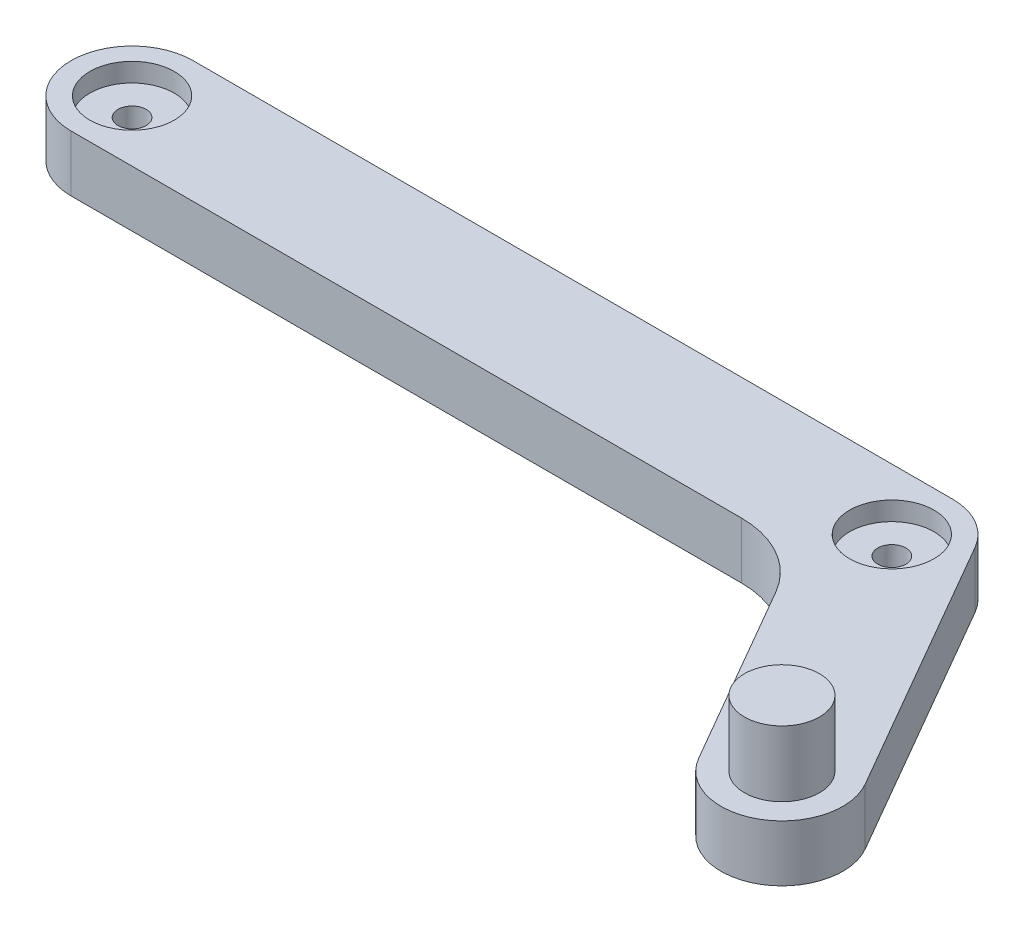
ISO-10303-21;
HEADER;
FILE_DESCRIPTION(('STEP AP214'),'2;1');
FILE_NAME('part.step','',(''),(''),'','','');
FILE_SCHEMA(('AUTOMOTIVE_DESIGN { 1 0 10303 214 1 1 1 1 }'));
ENDSEC;
DATA;
#1=APPLICATION_CONTEXT('core data for automotive mechanical design processes');
#2=APPLICATION_PROTOCOL_DEFINITION('international standard','automotive_design',2000,#1);
#3=PRODUCT_CONTEXT('',#1,'mechanical');
#4=PRODUCT('Part','Part','',(#3));
#5=PRODUCT_RELATED_PRODUCT_CATEGORY('part','',(#4));
#6=PRODUCT_DEFINITION_FORMATION('','',#4);
#7=PRODUCT_DEFINITION_CONTEXT('part definition',#1,'design');
#8=PRODUCT_DEFINITION('design','',#6,#7);
#9=PRODUCT_DEFINITION_SHAPE('','',#8);
#10=(LENGTH_UNIT() NAMED_UNIT(*) SI_UNIT(.MILLI.,.METRE.));
#11=(NAMED_UNIT(*) PLANE_ANGLE_UNIT() SI_UNIT($,.RADIAN.));
#12=(NAMED_UNIT(*) SI_UNIT($,.STERADIAN.) SOLID_ANGLE_UNIT());
#13=UNCERTAINTY_MEASURE_WITH_UNIT(LENGTH_MEASURE(1.E-05),#10,'distance_accuracy_value','');
#14=(GEOMETRIC_REPRESENTATION_CONTEXT(3) GLOBAL_UNCERTAINTY_ASSIGNED_CONTEXT((#13)) GLOBAL_UNIT_ASSIGNED_CONTEXT((#10,
#11,#12)) REPRESENTATION_CONTEXT('',''));
#15=CARTESIAN_POINT('',(0.,0.,0.));
#16=DIRECTION('',(0.,0.,1.));
#17=DIRECTION('',(1.,0.,0.));
#18=AXIS2_PLACEMENT_3D('',#15,#16,#17);
#19=CARTESIAN_POINT('',(0.,6.,0.));
#20=DIRECTION('',(0.,-1.,0.));
#21=DIRECTION('',(0.,0.,-1.));
#22=AXIS2_PLACEMENT_3D('',#19,#20,#21);
#23=CYLINDRICAL_SURFACE('',#22,1.5);
#24=CARTESIAN_POINT('',(0.,0.,0.));
#25=DIRECTION('',(0.,1.,0.));
#26=DIRECTION('',(0.,0.,1.));
#27=AXIS2_PLACEMENT_3D('',#24,#25,#26);
#28=CIRCLE('',#27,1.5);
#29=CARTESIAN_POINT('',(0.,0.,1.5));
#30=VERTEX_POINT('',#29);
#31=EDGE_CURVE('E152',#30,#30,#28,.T.);
#32=ORIENTED_EDGE('',*,*,#31,.F.);
#33=EDGE_LOOP('',(#32));
#34=FACE_BOUND('',#33,.T.);
#35=CARTESIAN_POINT('',(0.,4.,0.));
#36=DIRECTION('',(0.,1.,0.));
#37=DIRECTION('',(0.,0.,1.));
#38=AXIS2_PLACEMENT_3D('',#35,#36,#37);
#39=CIRCLE('',#38,1.5);
#40=CARTESIAN_POINT('',(0.,4.,1.5));
#41=VERTEX_POINT('',#40);
#42=EDGE_CURVE('E47',#41,#41,#39,.T.);
#43=ORIENTED_EDGE('',*,*,#42,.T.);
#44=EDGE_LOOP('',(#43));
#45=FACE_BOUND('',#44,.T.);
#46=ADVANCED_FACE('F43',(#34,#45),#23,.F.);
#47=CARTESIAN_POINT('',(81.,6.,0.));
#48=DIRECTION('',(0.,-1.,0.));
#49=DIRECTION('',(0.,0.,-1.));
#50=AXIS2_PLACEMENT_3D('',#47,#48,#49);
#51=CYLINDRICAL_SURFACE('',#50,1.5);
#52=CARTESIAN_POINT('',(81.,0.,0.));
#53=DIRECTION('',(0.,1.,0.));
#54=DIRECTION('',(0.,0.,1.));
#55=AXIS2_PLACEMENT_3D('',#52,#53,#54);
#56=CIRCLE('',#55,1.5);
#57=CARTESIAN_POINT('',(81.,0.,1.5));
#58=VERTEX_POINT('',#57);
#59=EDGE_CURVE('E196',#58,#58,#56,.T.);
#60=ORIENTED_EDGE('',*,*,#59,.F.);
#61=EDGE_LOOP('',(#60));
#62=FACE_BOUND('',#61,.T.);
#63=CARTESIAN_POINT('',(81.,4.,0.));
#64=DIRECTION('',(0.,1.,0.));
#65=DIRECTION('',(0.,0.,1.));
#66=AXIS2_PLACEMENT_3D('',#63,#64,#65);
#67=CIRCLE('',#66,1.5);
#68=CARTESIAN_POINT('',(81.,4.,1.5));
#69=VERTEX_POINT('',#68);
#70=EDGE_CURVE('E187',#69,#69,#67,.T.);
#71=ORIENTED_EDGE('',*,*,#70,.T.);
#72=EDGE_LOOP('',(#71));
#73=FACE_BOUND('',#72,.T.);
#74=ADVANCED_FACE('F266',(#62,#73),#51,.F.);
#75=CARTESIAN_POINT('',(0.,6.,0.));
#76=DIRECTION('',(0.,1.,0.));
#77=DIRECTION('',(0.,0.,1.));
#78=AXIS2_PLACEMENT_3D('',#75,#76,#77);
#79=PLANE('',#78);
#80=CARTESIAN_POINT('',(96.9999999999999,6.,27.7128129211021));
#81=DIRECTION('',(0.,1.,0.));
#82=DIRECTION('',(0.,0.,1.));
#83=AXIS2_PLACEMENT_3D('',#80,#81,#82);
#84=CIRCLE('',#83,4.00000000000001);
#85=CARTESIAN_POINT('',(96.9999999999999,6.,31.7128129211021));
#86=VERTEX_POINT('',#85);
#87=EDGE_CURVE('E207',#86,#86,#84,.T.);
#88=ORIENTED_EDGE('',*,*,#87,.F.);
#89=EDGE_LOOP('',(#88));
#90=FACE_BOUND('',#89,.T.);
#91=CARTESIAN_POINT('',(81.,6.,0.));
#92=DIRECTION('',(0.,1.,0.));
#93=DIRECTION('',(0.,0.,1.));
#94=AXIS2_PLACEMENT_3D('',#91,#92,#93);
#95=CIRCLE('',#94,4.49999999999999);
#96=CARTESIAN_POINT('',(81.,6.,4.49999999999999));
#97=VERTEX_POINT('',#96);
#98=EDGE_CURVE('E198',#97,#97,#95,.T.);
#99=ORIENTED_EDGE('',*,*,#98,.F.);
#100=EDGE_LOOP('',(#99));
#101=FACE_BOUND('',#100,.T.);
#102=CARTESIAN_POINT('',(0.,6.,0.));
#103=DIRECTION('',(0.,1.,0.));
#104=DIRECTION('',(0.,0.,1.));
#105=AXIS2_PLACEMENT_3D('',#102,#103,#104);
#106=CIRCLE('',#105,4.5);
#107=CARTESIAN_POINT('',(0.,6.,4.5));
#108=VERTEX_POINT('',#107);
#109=EDGE_CURVE('E204',#108,#108,#106,.T.);
#110=ORIENTED_EDGE('',*,*,#109,.F.);
#111=EDGE_LOOP('',(#110));
#112=FACE_BOUND('',#111,.T.);
#113=CARTESIAN_POINT('',(0.,6.,0.));
#114=DIRECTION('',(0.,1.,0.));
#115=DIRECTION('',(0.,0.,1.));
#116=AXIS2_PLACEMENT_3D('',#113,#114,#115);
#117=CIRCLE('',#116,6.5);
#118=CARTESIAN_POINT('',(0.,6.,-6.5));
#119=VERTEX_POINT('',#118);
#120=CARTESIAN_POINT('',(0.,6.,6.5));
#121=VERTEX_POINT('',#120);
#122=EDGE_CURVE('E170',#119,#121,#117,.T.);
#123=ORIENTED_EDGE('',*,*,#122,.T.);
#124=DIRECTION('',(1.,0.,0.));
#125=VECTOR('',#124,1.);
#126=CARTESIAN_POINT('',(0.,6.,6.5));
#127=LINE('',#126,#125);
#128=CARTESIAN_POINT('',(71.4737205583711,6.,6.49999999999999));
#129=VERTEX_POINT('',#128);
#130=EDGE_CURVE('E106',#121,#129,#127,.T.);
#131=ORIENTED_EDGE('',*,*,#130,.T.);
#132=CARTESIAN_POINT('',(71.4737205583711,6.,16.5));
#133=DIRECTION('',(0.,-1.,0.));
#134=DIRECTION('',(0.,0.,1.));
#135=AXIS2_PLACEMENT_3D('',#132,#133,#134);
#136=CIRCLE('',#135,10.);
#137=CARTESIAN_POINT('',(80.1339745962156,6.,11.5));
#138=VERTEX_POINT('',#137);
#139=EDGE_CURVE('E228',#129,#138,#136,.T.);
#140=ORIENTED_EDGE('',*,*,#139,.T.);
#141=DIRECTION('',(0.499999999999998,0.,0.86602540378444));
#142=VECTOR('',#141,1.);
#143=CARTESIAN_POINT('',(80.1339745962156,6.,11.5));
#144=LINE('',#143,#142);
#145=CARTESIAN_POINT('',(91.3708348754011,6.,30.9628129211021));
#146=VERTEX_POINT('',#145);
#147=EDGE_CURVE('E231',#138,#146,#144,.T.);
#148=ORIENTED_EDGE('',*,*,#147,.T.);
#149=CARTESIAN_POINT('',(96.9999999999999,6.,27.7128129211021));
#150=DIRECTION('',(0.,1.,0.));
#151=DIRECTION('',(0.,0.,1.));
#152=AXIS2_PLACEMENT_3D('',#149,#150,#151);
#153=CIRCLE('',#152,6.5);
#154=CARTESIAN_POINT('',(102.629165124599,6.,24.4628129211021));
#155=VERTEX_POINT('',#154);
#156=EDGE_CURVE('E125',#146,#155,#153,.T.);
#157=ORIENTED_EDGE('',*,*,#156,.T.);
#158=DIRECTION('',(-0.499999999999998,0.,-0.86602540378444));
#159=VECTOR('',#158,1.);
#160=CARTESIAN_POINT('',(86.6291651245989,6.,-3.24999999999999));
#161=LINE('',#160,#159);
#162=CARTESIAN_POINT('',(86.6291651245989,6.,-3.24999999999998));
#163=VERTEX_POINT('',#162);
#164=EDGE_CURVE('E119',#155,#163,#161,.T.);
#165=ORIENTED_EDGE('',*,*,#164,.T.);
#166=CARTESIAN_POINT('',(81.,6.,0.));
#167=DIRECTION('',(0.,1.,0.));
#168=DIRECTION('',(0.,0.,1.));
#169=AXIS2_PLACEMENT_3D('',#166,#167,#168);
#170=CIRCLE('',#169,6.5);
#171=CARTESIAN_POINT('',(81.,6.,-6.5));
#172=VERTEX_POINT('',#171);
#173=EDGE_CURVE('E123',#163,#172,#170,.T.);
#174=ORIENTED_EDGE('',*,*,#173,.T.);
#175=DIRECTION('',(-1.,0.,0.));
#176=VECTOR('',#175,1.);
#177=CARTESIAN_POINT('',(0.,6.,-6.5));
#178=LINE('',#177,#176);
#179=EDGE_CURVE('E63',#172,#119,#178,.T.);
#180=ORIENTED_EDGE('',*,*,#179,.T.);
#181=EDGE_LOOP('',(#123,#131,#140,#148,#157,#165,#174,#180));
#182=FACE_BOUND('',#181,.T.);
#183=ADVANCED_FACE('F121',(#90,#101,#112,#182),#79,.T.);
#184=CARTESIAN_POINT('',(0.,0.,0.));
#185=DIRECTION('',(0.,1.,0.));
#186=DIRECTION('',(0.,0.,1.));
#187=AXIS2_PLACEMENT_3D('',#184,#185,#186);
#188=PLANE('',#187);
#189=CARTESIAN_POINT('',(0.,0.,0.));
#190=DIRECTION('',(0.,1.,0.));
#191=DIRECTION('',(0.,0.,1.));
#192=AXIS2_PLACEMENT_3D('',#189,#190,#191);
#193=CIRCLE('',#192,6.5);
#194=CARTESIAN_POINT('',(0.,0.,-6.5));
#195=VERTEX_POINT('',#194);
#196=CARTESIAN_POINT('',(0.,0.,6.5));
#197=VERTEX_POINT('',#196);
#198=EDGE_CURVE('E147',#195,#197,#193,.T.);
#199=ORIENTED_EDGE('',*,*,#198,.F.);
#200=DIRECTION('',(-1.,0.,0.));
#201=VECTOR('',#200,1.);
#202=CARTESIAN_POINT('',(0.,0.,-6.5));
#203=LINE('',#202,#201);
#204=CARTESIAN_POINT('',(81.,0.,-6.5));
#205=VERTEX_POINT('',#204);
#206=EDGE_CURVE('E98',#205,#195,#203,.T.);
#207=ORIENTED_EDGE('',*,*,#206,.F.);
#208=CARTESIAN_POINT('',(81.,0.,0.));
#209=DIRECTION('',(0.,1.,0.));
#210=DIRECTION('',(0.,0.,1.));
#211=AXIS2_PLACEMENT_3D('',#208,#209,#210);
#212=CIRCLE('',#211,6.5);
#213=CARTESIAN_POINT('',(86.6291651245989,0.,-3.24999999999998));
#214=VERTEX_POINT('',#213);
#215=EDGE_CURVE('E92',#214,#205,#212,.T.);
#216=ORIENTED_EDGE('',*,*,#215,.F.);
#217=DIRECTION('',(-0.499999999999998,0.,-0.86602540378444));
#218=VECTOR('',#217,1.);
#219=CARTESIAN_POINT('',(86.6291651245989,0.,-3.24999999999999));
#220=LINE('',#219,#218);
#221=CARTESIAN_POINT('',(102.629165124599,0.,24.4628129211021));
#222=VERTEX_POINT('',#221);
#223=EDGE_CURVE('E134',#222,#214,#220,.T.);
#224=ORIENTED_EDGE('',*,*,#223,.F.);
#225=CARTESIAN_POINT('',(96.9999999999999,0.,27.7128129211021));
#226=DIRECTION('',(0.,1.,0.));
#227=DIRECTION('',(0.,0.,1.));
#228=AXIS2_PLACEMENT_3D('',#225,#226,#227);
#229=CIRCLE('',#228,6.5);
#230=CARTESIAN_POINT('',(91.3708348754011,0.,30.9628129211021));
#231=VERTEX_POINT('',#230);
#232=EDGE_CURVE('E161',#231,#222,#229,.T.);
#233=ORIENTED_EDGE('',*,*,#232,.F.);
#234=DIRECTION('',(0.499999999999998,0.,0.86602540378444));
#235=VECTOR('',#234,1.);
#236=CARTESIAN_POINT('',(80.1339745962156,0.,11.5));
#237=LINE('',#236,#235);
#238=CARTESIAN_POINT('',(80.1339745962156,0.,11.5));
#239=VERTEX_POINT('',#238);
#240=EDGE_CURVE('E158',#239,#231,#237,.T.);
#241=ORIENTED_EDGE('',*,*,#240,.F.);
#242=CARTESIAN_POINT('',(71.4737205583711,0.,16.5));
#243=DIRECTION('',(0.,-1.,0.));
#244=DIRECTION('',(0.,0.,1.));
#245=AXIS2_PLACEMENT_3D('',#242,#243,#244);
#246=CIRCLE('',#245,10.);
#247=CARTESIAN_POINT('',(71.4737205583711,0.,6.49999999999999));
#248=VERTEX_POINT('',#247);
#249=EDGE_CURVE('E155',#248,#239,#246,.T.);
#250=ORIENTED_EDGE('',*,*,#249,.F.);
#251=DIRECTION('',(1.,0.,0.));
#252=VECTOR('',#251,1.);
#253=CARTESIAN_POINT('',(0.,0.,6.5));
#254=LINE('',#253,#252);
#255=EDGE_CURVE('E151',#197,#248,#254,.T.);
#256=ORIENTED_EDGE('',*,*,#255,.F.);
#257=EDGE_LOOP('',(#199,#207,#216,#224,#233,#241,#250,#256));
#258=FACE_BOUND('',#257,.T.);
#259=ORIENTED_EDGE('',*,*,#31,.T.);
#260=EDGE_LOOP('',(#259));
#261=FACE_BOUND('',#260,.T.);
#262=ORIENTED_EDGE('',*,*,#59,.T.);
#263=EDGE_LOOP('',(#262));
#264=FACE_BOUND('',#263,.T.);
#265=ADVANCED_FACE('F246',(#258,#261,#264),#188,.F.);
#266=CARTESIAN_POINT('',(0.,6.,0.));
#267=DIRECTION('',(0.,-1.,0.));
#268=DIRECTION('',(0.,0.,-1.));
#269=AXIS2_PLACEMENT_3D('',#266,#267,#268);
#270=CYLINDRICAL_SURFACE('',#269,6.5);
#271=ORIENTED_EDGE('',*,*,#198,.T.);
#272=DIRECTION('',(0.,-1.,0.));
#273=VECTOR('',#272,1.);
#274=CARTESIAN_POINT('',(0.,6.,6.5));
#275=LINE('',#274,#273);
#276=EDGE_CURVE('E11',#121,#197,#275,.T.);
#277=ORIENTED_EDGE('',*,*,#276,.F.);
#278=ORIENTED_EDGE('',*,*,#122,.F.);
#279=DIRECTION('',(0.,-1.,0.));
#280=VECTOR('',#279,1.);
#281=CARTESIAN_POINT('',(0.,6.,-6.5));
#282=LINE('',#281,#280);
#283=EDGE_CURVE('E143',#119,#195,#282,.T.);
#284=ORIENTED_EDGE('',*,*,#283,.T.);
#285=EDGE_LOOP('',(#271,#277,#278,#284));
#286=FACE_BOUND('',#285,.T.);
#287=ADVANCED_FACE('F45',(#286),#270,.T.);
#288=CARTESIAN_POINT('',(0.,6.,6.5));
#289=DIRECTION('',(0.,0.,-1.));
#290=DIRECTION('',(-1.,0.,0.));
#291=AXIS2_PLACEMENT_3D('',#288,#289,#290);
#292=PLANE('',#291);
#293=ORIENTED_EDGE('',*,*,#255,.T.);
#294=DIRECTION('',(0.,-1.,0.));
#295=VECTOR('',#294,1.);
#296=CARTESIAN_POINT('',(71.4737205583711,6.,6.49999999999999));
#297=LINE('',#296,#295);
#298=EDGE_CURVE('E54',#129,#248,#297,.T.);
#299=ORIENTED_EDGE('',*,*,#298,.F.);
#300=ORIENTED_EDGE('',*,*,#130,.F.);
#301=ORIENTED_EDGE('',*,*,#276,.T.);
#302=EDGE_LOOP('',(#293,#299,#300,#301));
#303=FACE_BOUND('',#302,.T.);
#304=ADVANCED_FACE('F284',(#303),#292,.F.);
#305=CARTESIAN_POINT('',(71.4737205583711,6.,16.5));
#306=DIRECTION('',(0.,-1.,0.));
#307=DIRECTION('',(0.,0.,-1.));
#308=AXIS2_PLACEMENT_3D('',#305,#306,#307);
#309=CYLINDRICAL_SURFACE('',#308,10.);
#310=ORIENTED_EDGE('',*,*,#249,.T.);
#311=DIRECTION('',(0.,-1.,0.));
#312=VECTOR('',#311,1.);
#313=CARTESIAN_POINT('',(80.1339745962156,6.,11.5));
#314=LINE('',#313,#312);
#315=EDGE_CURVE('E181',#138,#239,#314,.T.);
#316=ORIENTED_EDGE('',*,*,#315,.F.);
#317=ORIENTED_EDGE('',*,*,#139,.F.);
#318=ORIENTED_EDGE('',*,*,#298,.T.);
#319=EDGE_LOOP('',(#310,#316,#317,#318));
#320=FACE_BOUND('',#319,.T.);
#321=ADVANCED_FACE('F288',(#320),#309,.F.);
#322=CARTESIAN_POINT('',(80.1339745962156,6.,11.5));
#323=DIRECTION('',(0.86602540378444,0.,-0.499999999999998));
#324=DIRECTION('',(-0.499999999999998,0.,-0.86602540378444));
#325=AXIS2_PLACEMENT_3D('',#322,#323,#324);
#326=PLANE('',#325);
#327=ORIENTED_EDGE('',*,*,#240,.T.);
#328=DIRECTION('',(0.,-1.,0.));
#329=VECTOR('',#328,1.);
#330=CARTESIAN_POINT('',(91.3708348754011,6.,30.9628129211021));
#331=LINE('',#330,#329);
#332=EDGE_CURVE('E177',#146,#231,#331,.T.);
#333=ORIENTED_EDGE('',*,*,#332,.F.);
#334=ORIENTED_EDGE('',*,*,#147,.F.);
#335=ORIENTED_EDGE('',*,*,#315,.T.);
#336=EDGE_LOOP('',(#327,#333,#334,#335));
#337=FACE_BOUND('',#336,.T.);
#338=ADVANCED_FACE('F239',(#337),#326,.F.);
#339=CARTESIAN_POINT('',(96.9999999999999,6.,27.7128129211021));
#340=DIRECTION('',(0.,-1.,0.));
#341=DIRECTION('',(0.,0.,-1.));
#342=AXIS2_PLACEMENT_3D('',#339,#340,#341);
#343=CYLINDRICAL_SURFACE('',#342,6.5);
#344=ORIENTED_EDGE('',*,*,#232,.T.);
#345=DIRECTION('',(0.,-1.,0.));
#346=VECTOR('',#345,1.);
#347=CARTESIAN_POINT('',(102.629165124599,6.,24.4628129211021));
#348=LINE('',#347,#346);
#349=EDGE_CURVE('E136',#155,#222,#348,.T.);
#350=ORIENTED_EDGE('',*,*,#349,.F.);
#351=ORIENTED_EDGE('',*,*,#156,.F.);
#352=ORIENTED_EDGE('',*,*,#332,.T.);
#353=EDGE_LOOP('',(#344,#350,#351,#352));
#354=FACE_BOUND('',#353,.T.);
#355=ADVANCED_FACE('F243',(#354),#343,.T.);
#356=CARTESIAN_POINT('',(86.6291651245989,6.,-3.24999999999999));
#357=DIRECTION('',(-0.86602540378444,0.,0.499999999999998));
#358=DIRECTION('',(0.499999999999998,0.,0.86602540378444));
#359=AXIS2_PLACEMENT_3D('',#356,#357,#358);
#360=PLANE('',#359);
#361=ORIENTED_EDGE('',*,*,#223,.T.);
#362=DIRECTION('',(0.,-1.,0.));
#363=VECTOR('',#362,1.);
#364=CARTESIAN_POINT('',(86.6291651245989,6.,-3.24999999999998));
#365=LINE('',#364,#363);
#366=EDGE_CURVE('E131',#163,#214,#365,.T.);
#367=ORIENTED_EDGE('',*,*,#366,.F.);
#368=ORIENTED_EDGE('',*,*,#164,.F.);
#369=ORIENTED_EDGE('',*,*,#349,.T.);
#370=EDGE_LOOP('',(#361,#367,#368,#369));
#371=FACE_BOUND('',#370,.T.);
#372=ADVANCED_FACE('F132',(#371),#360,.F.);
#373=CARTESIAN_POINT('',(81.,6.,0.));
#374=DIRECTION('',(0.,-1.,0.));
#375=DIRECTION('',(0.,0.,-1.));
#376=AXIS2_PLACEMENT_3D('',#373,#374,#375);
#377=CYLINDRICAL_SURFACE('',#376,6.5);
#378=ORIENTED_EDGE('',*,*,#215,.T.);
#379=DIRECTION('',(0.,-1.,0.));
#380=VECTOR('',#379,1.);
#381=CARTESIAN_POINT('',(81.,6.,-6.5));
#382=LINE('',#381,#380);
#383=EDGE_CURVE('E137',#172,#205,#382,.T.);
#384=ORIENTED_EDGE('',*,*,#383,.F.);
#385=ORIENTED_EDGE('',*,*,#173,.F.);
#386=ORIENTED_EDGE('',*,*,#366,.T.);
#387=EDGE_LOOP('',(#378,#384,#385,#386));
#388=FACE_BOUND('',#387,.T.);
#389=ADVANCED_FACE('F139',(#388),#377,.T.);
#390=CARTESIAN_POINT('',(0.,6.,-6.5));
#391=DIRECTION('',(0.,0.,1.));
#392=DIRECTION('',(1.,0.,0.));
#393=AXIS2_PLACEMENT_3D('',#390,#391,#392);
#394=PLANE('',#393);
#395=ORIENTED_EDGE('',*,*,#206,.T.);
#396=ORIENTED_EDGE('',*,*,#283,.F.);
#397=ORIENTED_EDGE('',*,*,#179,.F.);
#398=ORIENTED_EDGE('',*,*,#383,.T.);
#399=EDGE_LOOP('',(#395,#396,#397,#398));
#400=FACE_BOUND('',#399,.T.);
#401=ADVANCED_FACE('F252',(#400),#394,.F.);
#402=CARTESIAN_POINT('',(81.,4.,0.));
#403=DIRECTION('',(0.,1.,0.));
#404=DIRECTION('',(0.,0.,1.));
#405=AXIS2_PLACEMENT_3D('',#402,#403,#404);
#406=CYLINDRICAL_SURFACE('',#405,4.49999999999999);
#407=CARTESIAN_POINT('',(81.,4.,0.));
#408=DIRECTION('',(0.,1.,0.));
#409=DIRECTION('',(0.,0.,1.));
#410=AXIS2_PLACEMENT_3D('',#407,#408,#409);
#411=CIRCLE('',#410,4.49999999999999);
#412=CARTESIAN_POINT('',(81.,4.,4.49999999999999));
#413=VERTEX_POINT('',#412);
#414=EDGE_CURVE('E190',#413,#413,#411,.T.);
#415=ORIENTED_EDGE('',*,*,#414,.F.);
#416=EDGE_LOOP('',(#415));
#417=FACE_BOUND('',#416,.T.);
#418=ORIENTED_EDGE('',*,*,#98,.T.);
#419=EDGE_LOOP('',(#418));
#420=FACE_BOUND('',#419,.T.);
#421=ADVANCED_FACE('F254',(#417,#420),#406,.F.);
#422=CARTESIAN_POINT('',(81.,4.,0.));
#423=DIRECTION('',(0.,1.,0.));
#424=DIRECTION('',(0.,0.,1.));
#425=AXIS2_PLACEMENT_3D('',#422,#423,#424);
#426=PLANE('',#425);
#427=ORIENTED_EDGE('',*,*,#70,.F.);
#428=EDGE_LOOP('',(#427));
#429=FACE_BOUND('',#428,.T.);
#430=ORIENTED_EDGE('',*,*,#414,.T.);
#431=EDGE_LOOP('',(#430));
#432=FACE_BOUND('',#431,.T.);
#433=ADVANCED_FACE('F260',(#429,#432),#426,.T.);
#434=CARTESIAN_POINT('',(0.,4.,0.));
#435=DIRECTION('',(0.,1.,0.));
#436=DIRECTION('',(0.,0.,1.));
#437=AXIS2_PLACEMENT_3D('',#434,#435,#436);
#438=CYLINDRICAL_SURFACE('',#437,4.5);
#439=CARTESIAN_POINT('',(0.,4.,0.));
#440=DIRECTION('',(0.,1.,0.));
#441=DIRECTION('',(0.,0.,1.));
#442=AXIS2_PLACEMENT_3D('',#439,#440,#441);
#443=CIRCLE('',#442,4.5);
#444=CARTESIAN_POINT('',(0.,4.,4.5));
#445=VERTEX_POINT('',#444);
#446=EDGE_CURVE('E213',#445,#445,#443,.T.);
#447=ORIENTED_EDGE('',*,*,#446,.F.);
#448=EDGE_LOOP('',(#447));
#449=FACE_BOUND('',#448,.T.);
#450=ORIENTED_EDGE('',*,*,#109,.T.);
#451=EDGE_LOOP('',(#450));
#452=FACE_BOUND('',#451,.T.);
#453=ADVANCED_FACE('F340',(#449,#452),#438,.F.);
#454=CARTESIAN_POINT('',(0.,4.,0.));
#455=DIRECTION('',(0.,1.,0.));
#456=DIRECTION('',(0.,0.,1.));
#457=AXIS2_PLACEMENT_3D('',#454,#455,#456);
#458=PLANE('',#457);
#459=ORIENTED_EDGE('',*,*,#42,.F.);
#460=EDGE_LOOP('',(#459));
#461=FACE_BOUND('',#460,.T.);
#462=ORIENTED_EDGE('',*,*,#446,.T.);
#463=EDGE_LOOP('',(#462));
#464=FACE_BOUND('',#463,.T.);
#465=ADVANCED_FACE('F351',(#461,#464),#458,.T.);
#466=CARTESIAN_POINT('',(96.9999999999999,13.,27.7128129211021));
#467=DIRECTION('',(0.,-1.,0.));
#468=DIRECTION('',(0.,0.,-1.));
#469=AXIS2_PLACEMENT_3D('',#466,#467,#468);
#470=CYLINDRICAL_SURFACE('',#469,4.00000000000001);
#471=CARTESIAN_POINT('',(96.9999999999999,13.,27.7128129211021));
#472=DIRECTION('',(0.,1.,0.));
#473=DIRECTION('',(0.,0.,1.));
#474=AXIS2_PLACEMENT_3D('',#471,#472,#473);
#475=CIRCLE('',#474,4.00000000000001);
#476=CARTESIAN_POINT('',(96.9999999999999,13.,31.7128129211021));
#477=VERTEX_POINT('',#476);
#478=EDGE_CURVE('E217',#477,#477,#475,.T.);
#479=ORIENTED_EDGE('',*,*,#478,.F.);
#480=EDGE_LOOP('',(#479));
#481=FACE_BOUND('',#480,.T.);
#482=ORIENTED_EDGE('',*,*,#87,.T.);
#483=EDGE_LOOP('',(#482));
#484=FACE_BOUND('',#483,.T.);
#485=ADVANCED_FACE('F362',(#481,#484),#470,.T.);
#486=CARTESIAN_POINT('',(96.9999999999999,13.,27.7128129211021));
#487=DIRECTION('',(0.,1.,0.));
#488=DIRECTION('',(0.,0.,1.));
#489=AXIS2_PLACEMENT_3D('',#486,#487,#488);
#490=PLANE('',#489);
#491=ORIENTED_EDGE('',*,*,#478,.T.);
#492=EDGE_LOOP('',(#491));
#493=FACE_BOUND('',#492,.T.);
#494=ADVANCED_FACE('F380',(#493),#490,.T.);
#495=CLOSED_SHELL('',(#46,#74,#183,#265,#287,#304,#321,#338,#355,#372,#389,#401,#421,#433,#453,
#465,#485,#494));
#496=MANIFOLD_SOLID_BREP('B2',#495);
#497=ADVANCED_BREP_SHAPE_REPRESENTATION('',(#18,#496),#14);
#498=SHAPE_DEFINITION_REPRESENTATION(#9,#497);
ENDSEC;
END-ISO-10303-21;
